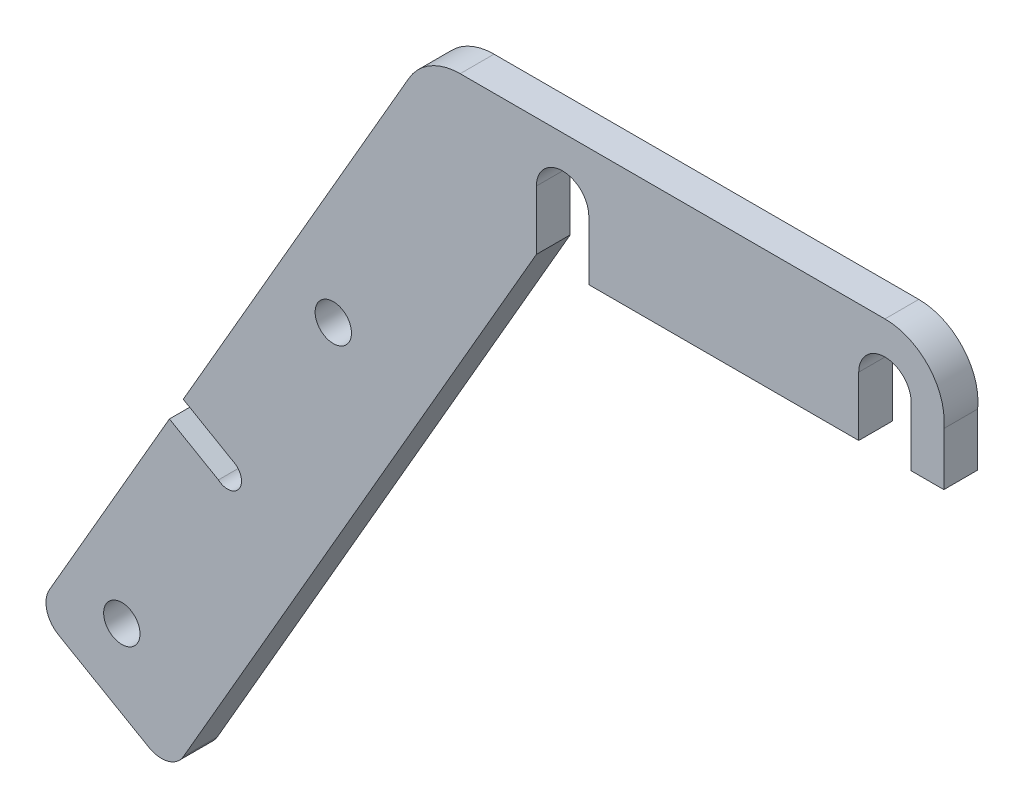
ISO-10303-21;
HEADER;
FILE_DESCRIPTION(('STEP AP214'),'2;1');
FILE_NAME('part.step','',(''),(''),'','','');
FILE_SCHEMA(('AUTOMOTIVE_DESIGN { 1 0 10303 214 1 1 1 1 }'));
ENDSEC;
DATA;
#1=APPLICATION_CONTEXT('core data for automotive mechanical design processes');
#2=APPLICATION_PROTOCOL_DEFINITION('international standard','automotive_design',2000,#1);
#3=PRODUCT_CONTEXT('',#1,'mechanical');
#4=PRODUCT('Part','Part','',(#3));
#5=PRODUCT_RELATED_PRODUCT_CATEGORY('part','',(#4));
#6=PRODUCT_DEFINITION_FORMATION('','',#4);
#7=PRODUCT_DEFINITION_CONTEXT('part definition',#1,'design');
#8=PRODUCT_DEFINITION('design','',#6,#7);
#9=PRODUCT_DEFINITION_SHAPE('','',#8);
#10=(LENGTH_UNIT() NAMED_UNIT(*) SI_UNIT(.MILLI.,.METRE.));
#11=(NAMED_UNIT(*) PLANE_ANGLE_UNIT() SI_UNIT($,.RADIAN.));
#12=(NAMED_UNIT(*) SI_UNIT($,.STERADIAN.) SOLID_ANGLE_UNIT());
#13=UNCERTAINTY_MEASURE_WITH_UNIT(LENGTH_MEASURE(1.E-05),#10,'distance_accuracy_value','');
#14=(GEOMETRIC_REPRESENTATION_CONTEXT(3) GLOBAL_UNCERTAINTY_ASSIGNED_CONTEXT((#13)) GLOBAL_UNIT_ASSIGNED_CONTEXT((#10,
#11,#12)) REPRESENTATION_CONTEXT('',''));
#15=CARTESIAN_POINT('',(0.,0.,0.));
#16=DIRECTION('',(0.,0.,1.));
#17=DIRECTION('',(1.,0.,0.));
#18=AXIS2_PLACEMENT_3D('',#15,#16,#17);
#19=CARTESIAN_POINT('',(0.,0.,4.));
#20=DIRECTION('',(0.,0.,1.));
#21=DIRECTION('',(1.,0.,0.));
#22=AXIS2_PLACEMENT_3D('',#19,#20,#21);
#23=PLANE('',#22);
#24=CARTESIAN_POINT('',(-52.1066641993581,-69.2820323027551,4.));
#25=DIRECTION('',(0.,0.,1.));
#26=DIRECTION('',(1.,0.,0.));
#27=AXIS2_PLACEMENT_3D('',#24,#25,#26);
#28=CIRCLE('',#27,2.15);
#29=CARTESIAN_POINT('',(-49.9566641993581,-69.2820323027551,4.));
#30=VERTEX_POINT('',#29);
#31=EDGE_CURVE('E210',#30,#30,#28,.T.);
#32=ORIENTED_EDGE('',*,*,#31,.F.);
#33=EDGE_LOOP('',(#32));
#34=FACE_BOUND('',#33,.T.);
#35=CARTESIAN_POINT('',(0.,0.,4.));
#36=DIRECTION('',(0.,0.,-1.));
#37=DIRECTION('',(1.,0.,0.));
#38=AXIS2_PLACEMENT_3D('',#35,#36,#37);
#39=CIRCLE('',#38,3.1);
#40=CARTESIAN_POINT('',(-3.1,0.,4.));
#41=VERTEX_POINT('',#40);
#42=CARTESIAN_POINT('',(3.1,0.,4.));
#43=VERTEX_POINT('',#42);
#44=EDGE_CURVE('E247',#41,#43,#39,.T.);
#45=ORIENTED_EDGE('',*,*,#44,.T.);
#46=DIRECTION('',(0.,-1.,0.));
#47=VECTOR('',#46,1.);
#48=CARTESIAN_POINT('',(3.1,0.,4.));
#49=LINE('',#48,#47);
#50=CARTESIAN_POINT('',(3.1,-7.,4.));
#51=VERTEX_POINT('',#50);
#52=EDGE_CURVE('E130',#43,#51,#49,.T.);
#53=ORIENTED_EDGE('',*,*,#52,.T.);
#54=DIRECTION('',(1.,0.,0.));
#55=VECTOR('',#54,1.);
#56=CARTESIAN_POINT('',(3.1,-7.,4.));
#57=LINE('',#56,#55);
#58=CARTESIAN_POINT('',(35.005,-7.,4.));
#59=VERTEX_POINT('',#58);
#60=EDGE_CURVE('E301',#51,#59,#57,.T.);
#61=ORIENTED_EDGE('',*,*,#60,.T.);
#62=DIRECTION('',(0.,1.,0.));
#63=VECTOR('',#62,1.);
#64=CARTESIAN_POINT('',(35.005,-7.,4.));
#65=LINE('',#64,#63);
#66=CARTESIAN_POINT('',(35.005,0.,4.));
#67=VERTEX_POINT('',#66);
#68=EDGE_CURVE('E320',#59,#67,#65,.T.);
#69=ORIENTED_EDGE('',*,*,#68,.T.);
#70=CARTESIAN_POINT('',(38.105,0.,4.));
#71=DIRECTION('',(0.,0.,-1.));
#72=DIRECTION('',(1.,0.,0.));
#73=AXIS2_PLACEMENT_3D('',#70,#71,#72);
#74=CIRCLE('',#73,3.1);
#75=CARTESIAN_POINT('',(41.205,0.,4.));
#76=VERTEX_POINT('',#75);
#77=EDGE_CURVE('E317',#67,#76,#74,.T.);
#78=ORIENTED_EDGE('',*,*,#77,.T.);
#79=DIRECTION('',(0.,-1.,0.));
#80=VECTOR('',#79,1.);
#81=CARTESIAN_POINT('',(41.205,0.,4.));
#82=LINE('',#81,#80);
#83=CARTESIAN_POINT('',(41.205,-7.,4.));
#84=VERTEX_POINT('',#83);
#85=EDGE_CURVE('E319',#76,#84,#82,.T.);
#86=ORIENTED_EDGE('',*,*,#85,.T.);
#87=DIRECTION('',(1.,0.,0.));
#88=VECTOR('',#87,1.);
#89=CARTESIAN_POINT('',(41.205,-7.,4.));
#90=LINE('',#89,#88);
#91=CARTESIAN_POINT('',(45.0649258350727,-7.,4.));
#92=VERTEX_POINT('',#91);
#93=EDGE_CURVE('E322',#84,#92,#90,.T.);
#94=ORIENTED_EDGE('',*,*,#93,.T.);
#95=DIRECTION('',(0.,1.,0.));
#96=VECTOR('',#95,1.);
#97=CARTESIAN_POINT('',(45.0649258350727,-7.,4.));
#98=LINE('',#97,#96);
#99=CARTESIAN_POINT('',(45.0649258350727,-0.747952117643216,4.));
#100=VERTEX_POINT('',#99);
#101=EDGE_CURVE('E328',#92,#100,#98,.T.);
#102=ORIENTED_EDGE('',*,*,#101,.T.);
#103=CARTESIAN_POINT('',(38.105,0.,4.));
#104=DIRECTION('',(0.,0.,1.));
#105=DIRECTION('',(1.,0.,0.));
#106=AXIS2_PLACEMENT_3D('',#103,#104,#105);
#107=CIRCLE('',#106,7.);
#108=CARTESIAN_POINT('',(38.105,7.,4.));
#109=VERTEX_POINT('',#108);
#110=EDGE_CURVE('E330',#100,#109,#107,.T.);
#111=ORIENTED_EDGE('',*,*,#110,.T.);
#112=DIRECTION('',(-1.,0.,0.));
#113=VECTOR('',#112,1.);
#114=CARTESIAN_POINT('',(-12.1066641993582,7.,4.));
#115=LINE('',#114,#113);
#116=CARTESIAN_POINT('',(-12.1066641993582,7.,4.));
#117=VERTEX_POINT('',#116);
#118=EDGE_CURVE('E332',#109,#117,#115,.T.);
#119=ORIENTED_EDGE('',*,*,#118,.T.);
#120=CARTESIAN_POINT('',(-12.1066641993582,0.,4.));
#121=DIRECTION('',(0.,0.,1.));
#122=DIRECTION('',(-1.,0.,0.));
#123=AXIS2_PLACEMENT_3D('',#120,#121,#122);
#124=CIRCLE('',#123,7.);
#125=CARTESIAN_POINT('',(-18.1688420258492,3.5,4.));
#126=VERTEX_POINT('',#125);
#127=EDGE_CURVE('E334',#117,#126,#124,.T.);
#128=ORIENTED_EDGE('',*,*,#127,.T.);
#129=DIRECTION('',(-0.5,-0.866025403784439,0.));
#130=VECTOR('',#129,1.);
#131=CARTESIAN_POINT('',(-18.1688420258492,3.5,4.));
#132=LINE('',#131,#130);
#133=CARTESIAN_POINT('',(-44.8438420258492,-42.7024552918998,4.));
#134=VERTEX_POINT('',#133);
#135=EDGE_CURVE('E336',#126,#134,#132,.T.);
#136=ORIENTED_EDGE('',*,*,#135,.T.);
#137=DIRECTION('',(0.86602540378444,-0.499999999999998,0.));
#138=VECTOR('',#137,1.);
#139=CARTESIAN_POINT('',(-38.7816641993581,-46.2024552918998,4.));
#140=LINE('',#139,#138);
#141=CARTESIAN_POINT('',(-38.7816641993581,-46.2024552918998,4.));
#142=VERTEX_POINT('',#141);
#143=EDGE_CURVE('E338',#134,#142,#140,.T.);
#144=ORIENTED_EDGE('',*,*,#143,.T.);
#145=CARTESIAN_POINT('',(-39.6066641993581,-47.6313972081441,4.));
#146=DIRECTION('',(0.,0.,-1.));
#147=DIRECTION('',(1.,0.,0.));
#148=AXIS2_PLACEMENT_3D('',#145,#146,#147);
#149=CIRCLE('',#148,1.65000000000001);
#150=CARTESIAN_POINT('',(-40.6904271192415,-48.8755667840002,4.));
#151=VERTEX_POINT('',#150);
#152=EDGE_CURVE('E340',#142,#151,#149,.T.);
#153=ORIENTED_EDGE('',*,*,#152,.T.);
#154=DIRECTION('',(-0.866025403784439,0.5,0.));
#155=VECTOR('',#154,1.);
#156=CARTESIAN_POINT('',(-40.6904271192415,-48.8755667840002,4.));
#157=LINE('',#156,#155);
#158=CARTESIAN_POINT('',(-46.4785239854736,-45.5338075001855,4.));
#159=VERTEX_POINT('',#158);
#160=EDGE_CURVE('E342',#151,#159,#157,.T.);
#161=ORIENTED_EDGE('',*,*,#160,.T.);
#162=DIRECTION('',(-0.5,-0.866025403784439,0.));
#163=VECTOR('',#162,1.);
#164=CARTESIAN_POINT('',(-46.4785239854736,-45.5338075001855,4.));
#165=LINE('',#164,#163);
#166=CARTESIAN_POINT('',(-60.6688420258492,-70.1121593216773,4.));
#167=VERTEX_POINT('',#166);
#168=EDGE_CURVE('E344',#159,#167,#165,.T.);
#169=ORIENTED_EDGE('',*,*,#168,.T.);
#170=CARTESIAN_POINT('',(-58.0707658144959,-71.6121593216773,4.));
#171=DIRECTION('',(0.,0.,1.));
#172=DIRECTION('',(-1.,0.,0.));
#173=AXIS2_PLACEMENT_3D('',#170,#171,#172);
#174=CIRCLE('',#173,3.00000000000001);
#175=CARTESIAN_POINT('',(-59.5707658144959,-74.2102355330306,4.));
#176=VERTEX_POINT('',#175);
#177=EDGE_CURVE('E346',#167,#176,#174,.T.);
#178=ORIENTED_EDGE('',*,*,#177,.T.);
#179=DIRECTION('',(0.86602540378444,-0.499999999999997,0.));
#180=VECTOR('',#179,1.);
#181=CARTESIAN_POINT('',(-59.5707658144959,-74.2102355330306,4.));
#182=LINE('',#181,#180);
#183=CARTESIAN_POINT('',(-48.9186533479473,-80.3602355330306,4.));
#184=VERTEX_POINT('',#183);
#185=EDGE_CURVE('E188',#176,#184,#182,.T.);
#186=ORIENTED_EDGE('',*,*,#185,.T.);
#187=CARTESIAN_POINT('',(-47.4186533479473,-77.7621593216773,4.));
#188=DIRECTION('',(0.,0.,1.));
#189=DIRECTION('',(1.,0.,0.));
#190=AXIS2_PLACEMENT_3D('',#187,#188,#189);
#191=CIRCLE('',#190,2.99999999999999);
#192=CARTESIAN_POINT('',(-44.820577136594,-79.2621593216773,4.));
#193=VERTEX_POINT('',#192);
#194=EDGE_CURVE('E182',#184,#193,#191,.T.);
#195=ORIENTED_EDGE('',*,*,#194,.T.);
#196=DIRECTION('',(0.5,0.866025403784439,0.));
#197=VECTOR('',#196,1.);
#198=CARTESIAN_POINT('',(-3.1,-7.,4.));
#199=LINE('',#198,#197);
#200=CARTESIAN_POINT('',(-3.1,-7.,4.));
#201=VERTEX_POINT('',#200);
#202=EDGE_CURVE('E186',#193,#201,#199,.T.);
#203=ORIENTED_EDGE('',*,*,#202,.T.);
#204=DIRECTION('',(0.,1.,0.));
#205=VECTOR('',#204,1.);
#206=CARTESIAN_POINT('',(-3.1,-7.,4.));
#207=LINE('',#206,#205);
#208=EDGE_CURVE('E48',#201,#41,#207,.T.);
#209=ORIENTED_EDGE('',*,*,#208,.T.);
#210=EDGE_LOOP('',(#45,#53,#61,#69,#78,#86,#94,#102,#111,#119,#128,#136,#144,#153,#161,#169,
#178,#186,#195,#203,#209));
#211=FACE_BOUND('',#210,.T.);
#212=CARTESIAN_POINT('',(-27.1066641993581,-25.9807621135332,4.));
#213=DIRECTION('',(0.,0.,1.));
#214=DIRECTION('',(1.,0.,0.));
#215=AXIS2_PLACEMENT_3D('',#212,#213,#214);
#216=CIRCLE('',#215,2.15);
#217=CARTESIAN_POINT('',(-24.9566641993581,-25.9807621135332,4.));
#218=VERTEX_POINT('',#217);
#219=EDGE_CURVE('E389',#218,#218,#216,.T.);
#220=ORIENTED_EDGE('',*,*,#219,.F.);
#221=EDGE_LOOP('',(#220));
#222=FACE_BOUND('',#221,.T.);
#223=ADVANCED_FACE('F31',(#34,#211,#222),#23,.T.);
#224=CARTESIAN_POINT('',(0.,0.,0.));
#225=DIRECTION('',(0.,0.,1.));
#226=DIRECTION('',(1.,0.,0.));
#227=AXIS2_PLACEMENT_3D('',#224,#225,#226);
#228=PLANE('',#227);
#229=CARTESIAN_POINT('',(-52.1066641993581,-69.2820323027551,0.));
#230=DIRECTION('',(0.,0.,1.));
#231=DIRECTION('',(1.,0.,0.));
#232=AXIS2_PLACEMENT_3D('',#229,#230,#231);
#233=CIRCLE('',#232,2.15);
#234=CARTESIAN_POINT('',(-49.9566641993581,-69.2820323027551,0.));
#235=VERTEX_POINT('',#234);
#236=EDGE_CURVE('E394',#235,#235,#233,.T.);
#237=ORIENTED_EDGE('',*,*,#236,.T.);
#238=EDGE_LOOP('',(#237));
#239=FACE_BOUND('',#238,.T.);
#240=CARTESIAN_POINT('',(0.,0.,0.));
#241=DIRECTION('',(0.,0.,-1.));
#242=DIRECTION('',(1.,0.,0.));
#243=AXIS2_PLACEMENT_3D('',#240,#241,#242);
#244=CIRCLE('',#243,3.1);
#245=CARTESIAN_POINT('',(-3.1,0.,0.));
#246=VERTEX_POINT('',#245);
#247=CARTESIAN_POINT('',(3.1,0.,0.));
#248=VERTEX_POINT('',#247);
#249=EDGE_CURVE('E206',#246,#248,#244,.T.);
#250=ORIENTED_EDGE('',*,*,#249,.F.);
#251=DIRECTION('',(0.,1.,0.));
#252=VECTOR('',#251,1.);
#253=CARTESIAN_POINT('',(-3.1,-7.,0.));
#254=LINE('',#253,#252);
#255=CARTESIAN_POINT('',(-3.1,-7.,0.));
#256=VERTEX_POINT('',#255);
#257=EDGE_CURVE('E122',#256,#246,#254,.T.);
#258=ORIENTED_EDGE('',*,*,#257,.F.);
#259=DIRECTION('',(0.5,0.866025403784439,0.));
#260=VECTOR('',#259,1.);
#261=CARTESIAN_POINT('',(-3.1,-7.,0.));
#262=LINE('',#261,#260);
#263=CARTESIAN_POINT('',(-44.820577136594,-79.2621593216773,0.));
#264=VERTEX_POINT('',#263);
#265=EDGE_CURVE('E116',#264,#256,#262,.T.);
#266=ORIENTED_EDGE('',*,*,#265,.F.);
#267=CARTESIAN_POINT('',(-47.4186533479473,-77.7621593216773,0.));
#268=DIRECTION('',(0.,0.,1.));
#269=DIRECTION('',(1.,0.,0.));
#270=AXIS2_PLACEMENT_3D('',#267,#268,#269);
#271=CIRCLE('',#270,2.99999999999999);
#272=CARTESIAN_POINT('',(-48.9186533479473,-80.3602355330306,0.));
#273=VERTEX_POINT('',#272);
#274=EDGE_CURVE('E196',#273,#264,#271,.T.);
#275=ORIENTED_EDGE('',*,*,#274,.F.);
#276=DIRECTION('',(0.86602540378444,-0.499999999999997,0.));
#277=VECTOR('',#276,1.);
#278=CARTESIAN_POINT('',(-59.5707658144959,-74.2102355330306,0.));
#279=LINE('',#278,#277);
#280=CARTESIAN_POINT('',(-59.5707658144959,-74.2102355330306,0.));
#281=VERTEX_POINT('',#280);
#282=EDGE_CURVE('E242',#281,#273,#279,.T.);
#283=ORIENTED_EDGE('',*,*,#282,.F.);
#284=CARTESIAN_POINT('',(-58.0707658144959,-71.6121593216773,0.));
#285=DIRECTION('',(0.,0.,1.));
#286=DIRECTION('',(-1.,0.,0.));
#287=AXIS2_PLACEMENT_3D('',#284,#285,#286);
#288=CIRCLE('',#287,3.00000000000001);
#289=CARTESIAN_POINT('',(-60.6688420258492,-70.1121593216773,0.));
#290=VERTEX_POINT('',#289);
#291=EDGE_CURVE('E240',#290,#281,#288,.T.);
#292=ORIENTED_EDGE('',*,*,#291,.F.);
#293=DIRECTION('',(-0.5,-0.866025403784439,0.));
#294=VECTOR('',#293,1.);
#295=CARTESIAN_POINT('',(-46.4785239854736,-45.5338075001855,0.));
#296=LINE('',#295,#294);
#297=CARTESIAN_POINT('',(-46.4785239854736,-45.5338075001855,0.));
#298=VERTEX_POINT('',#297);
#299=EDGE_CURVE('E238',#298,#290,#296,.T.);
#300=ORIENTED_EDGE('',*,*,#299,.F.);
#301=DIRECTION('',(-0.866025403784439,0.5,0.));
#302=VECTOR('',#301,1.);
#303=CARTESIAN_POINT('',(-40.6904271192415,-48.8755667840002,0.));
#304=LINE('',#303,#302);
#305=CARTESIAN_POINT('',(-40.6904271192415,-48.8755667840002,0.));
#306=VERTEX_POINT('',#305);
#307=EDGE_CURVE('E236',#306,#298,#304,.T.);
#308=ORIENTED_EDGE('',*,*,#307,.F.);
#309=CARTESIAN_POINT('',(-39.6066641993581,-47.6313972081441,0.));
#310=DIRECTION('',(0.,0.,-1.));
#311=DIRECTION('',(1.,0.,0.));
#312=AXIS2_PLACEMENT_3D('',#309,#310,#311);
#313=CIRCLE('',#312,1.65000000000001);
#314=CARTESIAN_POINT('',(-38.7816641993581,-46.2024552918998,0.));
#315=VERTEX_POINT('',#314);
#316=EDGE_CURVE('E234',#315,#306,#313,.T.);
#317=ORIENTED_EDGE('',*,*,#316,.F.);
#318=DIRECTION('',(0.86602540378444,-0.499999999999998,0.));
#319=VECTOR('',#318,1.);
#320=CARTESIAN_POINT('',(-38.7816641993581,-46.2024552918998,0.));
#321=LINE('',#320,#319);
#322=CARTESIAN_POINT('',(-44.8438420258492,-42.7024552918998,0.));
#323=VERTEX_POINT('',#322);
#324=EDGE_CURVE('E232',#323,#315,#321,.T.);
#325=ORIENTED_EDGE('',*,*,#324,.F.);
#326=DIRECTION('',(-0.5,-0.866025403784439,0.));
#327=VECTOR('',#326,1.);
#328=CARTESIAN_POINT('',(-18.1688420258492,3.5,0.));
#329=LINE('',#328,#327);
#330=CARTESIAN_POINT('',(-18.1688420258492,3.5,0.));
#331=VERTEX_POINT('',#330);
#332=EDGE_CURVE('E230',#331,#323,#329,.T.);
#333=ORIENTED_EDGE('',*,*,#332,.F.);
#334=CARTESIAN_POINT('',(-12.1066641993582,0.,0.));
#335=DIRECTION('',(0.,0.,1.));
#336=DIRECTION('',(-1.,0.,0.));
#337=AXIS2_PLACEMENT_3D('',#334,#335,#336);
#338=CIRCLE('',#337,7.);
#339=CARTESIAN_POINT('',(-12.1066641993582,7.,0.));
#340=VERTEX_POINT('',#339);
#341=EDGE_CURVE('E228',#340,#331,#338,.T.);
#342=ORIENTED_EDGE('',*,*,#341,.F.);
#343=DIRECTION('',(-1.,0.,0.));
#344=VECTOR('',#343,1.);
#345=CARTESIAN_POINT('',(-12.1066641993582,7.,0.));
#346=LINE('',#345,#344);
#347=CARTESIAN_POINT('',(38.105,7.,0.));
#348=VERTEX_POINT('',#347);
#349=EDGE_CURVE('E226',#348,#340,#346,.T.);
#350=ORIENTED_EDGE('',*,*,#349,.F.);
#351=CARTESIAN_POINT('',(38.105,0.,0.));
#352=DIRECTION('',(0.,0.,1.));
#353=DIRECTION('',(1.,0.,0.));
#354=AXIS2_PLACEMENT_3D('',#351,#352,#353);
#355=CIRCLE('',#354,7.);
#356=CARTESIAN_POINT('',(45.0649258350727,-0.747952117643216,0.));
#357=VERTEX_POINT('',#356);
#358=EDGE_CURVE('E224',#357,#348,#355,.T.);
#359=ORIENTED_EDGE('',*,*,#358,.F.);
#360=DIRECTION('',(0.,1.,0.));
#361=VECTOR('',#360,1.);
#362=CARTESIAN_POINT('',(45.0649258350727,-7.,0.));
#363=LINE('',#362,#361);
#364=CARTESIAN_POINT('',(45.0649258350727,-7.,0.));
#365=VERTEX_POINT('',#364);
#366=EDGE_CURVE('E222',#365,#357,#363,.T.);
#367=ORIENTED_EDGE('',*,*,#366,.F.);
#368=DIRECTION('',(1.,0.,0.));
#369=VECTOR('',#368,1.);
#370=CARTESIAN_POINT('',(41.205,-7.,0.));
#371=LINE('',#370,#369);
#372=CARTESIAN_POINT('',(41.205,-7.,0.));
#373=VERTEX_POINT('',#372);
#374=EDGE_CURVE('E220',#373,#365,#371,.T.);
#375=ORIENTED_EDGE('',*,*,#374,.F.);
#376=DIRECTION('',(0.,-1.,0.));
#377=VECTOR('',#376,1.);
#378=CARTESIAN_POINT('',(41.205,0.,0.));
#379=LINE('',#378,#377);
#380=CARTESIAN_POINT('',(41.205,0.,0.));
#381=VERTEX_POINT('',#380);
#382=EDGE_CURVE('E218',#381,#373,#379,.T.);
#383=ORIENTED_EDGE('',*,*,#382,.F.);
#384=CARTESIAN_POINT('',(38.105,0.,0.));
#385=DIRECTION('',(0.,0.,-1.));
#386=DIRECTION('',(1.,0.,0.));
#387=AXIS2_PLACEMENT_3D('',#384,#385,#386);
#388=CIRCLE('',#387,3.1);
#389=CARTESIAN_POINT('',(35.005,0.,0.));
#390=VERTEX_POINT('',#389);
#391=EDGE_CURVE('E216',#390,#381,#388,.T.);
#392=ORIENTED_EDGE('',*,*,#391,.F.);
#393=DIRECTION('',(0.,1.,0.));
#394=VECTOR('',#393,1.);
#395=CARTESIAN_POINT('',(35.005,-7.,0.));
#396=LINE('',#395,#394);
#397=CARTESIAN_POINT('',(35.005,-7.,0.));
#398=VERTEX_POINT('',#397);
#399=EDGE_CURVE('E214',#398,#390,#396,.T.);
#400=ORIENTED_EDGE('',*,*,#399,.F.);
#401=DIRECTION('',(1.,0.,0.));
#402=VECTOR('',#401,1.);
#403=CARTESIAN_POINT('',(3.1,-7.,0.));
#404=LINE('',#403,#402);
#405=CARTESIAN_POINT('',(3.1,-7.,0.));
#406=VERTEX_POINT('',#405);
#407=EDGE_CURVE('E212',#406,#398,#404,.T.);
#408=ORIENTED_EDGE('',*,*,#407,.F.);
#409=DIRECTION('',(0.,-1.,0.));
#410=VECTOR('',#409,1.);
#411=CARTESIAN_POINT('',(3.1,0.,0.));
#412=LINE('',#411,#410);
#413=EDGE_CURVE('E209',#248,#406,#412,.T.);
#414=ORIENTED_EDGE('',*,*,#413,.F.);
#415=EDGE_LOOP('',(#250,#258,#266,#275,#283,#292,#300,#308,#317,#325,#333,#342,#350,#359,#367,
#375,#383,#392,#400,#408,#414));
#416=FACE_BOUND('',#415,.T.);
#417=CARTESIAN_POINT('',(-27.1066641993581,-25.9807621135332,0.));
#418=DIRECTION('',(0.,0.,1.));
#419=DIRECTION('',(1.,0.,0.));
#420=AXIS2_PLACEMENT_3D('',#417,#418,#419);
#421=CIRCLE('',#420,2.15);
#422=CARTESIAN_POINT('',(-24.9566641993581,-25.9807621135332,0.));
#423=VERTEX_POINT('',#422);
#424=EDGE_CURVE('E392',#423,#423,#421,.T.);
#425=ORIENTED_EDGE('',*,*,#424,.T.);
#426=EDGE_LOOP('',(#425));
#427=FACE_BOUND('',#426,.T.);
#428=ADVANCED_FACE('F305',(#239,#416,#427),#228,.F.);
#429=CARTESIAN_POINT('',(0.,0.,4.));
#430=DIRECTION('',(0.,0.,-1.));
#431=DIRECTION('',(-1.,0.,0.));
#432=AXIS2_PLACEMENT_3D('',#429,#430,#431);
#433=CYLINDRICAL_SURFACE('',#432,3.1);
#434=ORIENTED_EDGE('',*,*,#249,.T.);
#435=DIRECTION('',(0.,0.,-1.));
#436=VECTOR('',#435,1.);
#437=CARTESIAN_POINT('',(3.1,0.,4.));
#438=LINE('',#437,#436);
#439=EDGE_CURVE('E11',#43,#248,#438,.T.);
#440=ORIENTED_EDGE('',*,*,#439,.F.);
#441=ORIENTED_EDGE('',*,*,#44,.F.);
#442=DIRECTION('',(0.,0.,-1.));
#443=VECTOR('',#442,1.);
#444=CARTESIAN_POINT('',(-3.1,0.,4.));
#445=LINE('',#444,#443);
#446=EDGE_CURVE('E202',#41,#246,#445,.T.);
#447=ORIENTED_EDGE('',*,*,#446,.T.);
#448=EDGE_LOOP('',(#434,#440,#441,#447));
#449=FACE_BOUND('',#448,.T.);
#450=ADVANCED_FACE('F33',(#449),#433,.F.);
#451=CARTESIAN_POINT('',(3.1,0.,4.));
#452=DIRECTION('',(1.,0.,0.));
#453=DIRECTION('',(0.,1.,0.));
#454=AXIS2_PLACEMENT_3D('',#451,#452,#453);
#455=PLANE('',#454);
#456=ORIENTED_EDGE('',*,*,#413,.T.);
#457=DIRECTION('',(0.,0.,-1.));
#458=VECTOR('',#457,1.);
#459=CARTESIAN_POINT('',(3.1,-7.,4.));
#460=LINE('',#459,#458);
#461=EDGE_CURVE('E40',#51,#406,#460,.T.);
#462=ORIENTED_EDGE('',*,*,#461,.F.);
#463=ORIENTED_EDGE('',*,*,#52,.F.);
#464=ORIENTED_EDGE('',*,*,#439,.T.);
#465=EDGE_LOOP('',(#456,#462,#463,#464));
#466=FACE_BOUND('',#465,.T.);
#467=ADVANCED_FACE('F577',(#466),#455,.F.);
#468=CARTESIAN_POINT('',(3.1,-7.,4.));
#469=DIRECTION('',(0.,1.,0.));
#470=DIRECTION('',(-1.,0.,0.));
#471=AXIS2_PLACEMENT_3D('',#468,#469,#470);
#472=PLANE('',#471);
#473=ORIENTED_EDGE('',*,*,#407,.T.);
#474=DIRECTION('',(0.,0.,-1.));
#475=VECTOR('',#474,1.);
#476=CARTESIAN_POINT('',(35.005,-7.,4.));
#477=LINE('',#476,#475);
#478=EDGE_CURVE('E293',#59,#398,#477,.T.);
#479=ORIENTED_EDGE('',*,*,#478,.F.);
#480=ORIENTED_EDGE('',*,*,#60,.F.);
#481=ORIENTED_EDGE('',*,*,#461,.T.);
#482=EDGE_LOOP('',(#473,#479,#480,#481));
#483=FACE_BOUND('',#482,.T.);
#484=ADVANCED_FACE('F299',(#483),#472,.F.);
#485=CARTESIAN_POINT('',(35.005,-7.,4.));
#486=DIRECTION('',(-1.,0.,0.));
#487=DIRECTION('',(0.,0.,1.));
#488=AXIS2_PLACEMENT_3D('',#485,#486,#487);
#489=PLANE('',#488);
#490=ORIENTED_EDGE('',*,*,#399,.T.);
#491=DIRECTION('',(0.,0.,-1.));
#492=VECTOR('',#491,1.);
#493=CARTESIAN_POINT('',(35.005,0.,4.));
#494=LINE('',#493,#492);
#495=EDGE_CURVE('E290',#67,#390,#494,.T.);
#496=ORIENTED_EDGE('',*,*,#495,.F.);
#497=ORIENTED_EDGE('',*,*,#68,.F.);
#498=ORIENTED_EDGE('',*,*,#478,.T.);
#499=EDGE_LOOP('',(#490,#496,#497,#498));
#500=FACE_BOUND('',#499,.T.);
#501=ADVANCED_FACE('F311',(#500),#489,.F.);
#502=CARTESIAN_POINT('',(38.105,0.,4.));
#503=DIRECTION('',(0.,0.,-1.));
#504=DIRECTION('',(-1.,0.,0.));
#505=AXIS2_PLACEMENT_3D('',#502,#503,#504);
#506=CYLINDRICAL_SURFACE('',#505,3.1);
#507=ORIENTED_EDGE('',*,*,#391,.T.);
#508=DIRECTION('',(0.,0.,-1.));
#509=VECTOR('',#508,1.);
#510=CARTESIAN_POINT('',(41.205,0.,4.));
#511=LINE('',#510,#509);
#512=EDGE_CURVE('E287',#76,#381,#511,.T.);
#513=ORIENTED_EDGE('',*,*,#512,.F.);
#514=ORIENTED_EDGE('',*,*,#77,.F.);
#515=ORIENTED_EDGE('',*,*,#495,.T.);
#516=EDGE_LOOP('',(#507,#513,#514,#515));
#517=FACE_BOUND('',#516,.T.);
#518=ADVANCED_FACE('F315',(#517),#506,.F.);
#519=CARTESIAN_POINT('',(41.205,0.,4.));
#520=DIRECTION('',(1.,0.,0.));
#521=DIRECTION('',(0.,0.,-1.));
#522=AXIS2_PLACEMENT_3D('',#519,#520,#521);
#523=PLANE('',#522);
#524=ORIENTED_EDGE('',*,*,#382,.T.);
#525=DIRECTION('',(0.,0.,-1.));
#526=VECTOR('',#525,1.);
#527=CARTESIAN_POINT('',(41.205,-7.,4.));
#528=LINE('',#527,#526);
#529=EDGE_CURVE('E284',#84,#373,#528,.T.);
#530=ORIENTED_EDGE('',*,*,#529,.F.);
#531=ORIENTED_EDGE('',*,*,#85,.F.);
#532=ORIENTED_EDGE('',*,*,#512,.T.);
#533=EDGE_LOOP('',(#524,#530,#531,#532));
#534=FACE_BOUND('',#533,.T.);
#535=ADVANCED_FACE('F542',(#534),#523,.F.);
#536=CARTESIAN_POINT('',(41.205,-7.,4.));
#537=DIRECTION('',(0.,1.,0.));
#538=DIRECTION('',(0.,0.,1.));
#539=AXIS2_PLACEMENT_3D('',#536,#537,#538);
#540=PLANE('',#539);
#541=ORIENTED_EDGE('',*,*,#374,.T.);
#542=DIRECTION('',(0.,0.,-1.));
#543=VECTOR('',#542,1.);
#544=CARTESIAN_POINT('',(45.0649258350727,-7.,4.));
#545=LINE('',#544,#543);
#546=EDGE_CURVE('E281',#92,#365,#545,.T.);
#547=ORIENTED_EDGE('',*,*,#546,.F.);
#548=ORIENTED_EDGE('',*,*,#93,.F.);
#549=ORIENTED_EDGE('',*,*,#529,.T.);
#550=EDGE_LOOP('',(#541,#547,#548,#549));
#551=FACE_BOUND('',#550,.T.);
#552=ADVANCED_FACE('F532',(#551),#540,.F.);
#553=CARTESIAN_POINT('',(45.0649258350727,-7.,4.));
#554=DIRECTION('',(-1.,0.,0.));
#555=DIRECTION('',(0.,0.,1.));
#556=AXIS2_PLACEMENT_3D('',#553,#554,#555);
#557=PLANE('',#556);
#558=ORIENTED_EDGE('',*,*,#366,.T.);
#559=DIRECTION('',(0.,0.,-1.));
#560=VECTOR('',#559,1.);
#561=CARTESIAN_POINT('',(45.0649258350727,-0.747952117643216,4.));
#562=LINE('',#561,#560);
#563=EDGE_CURVE('E278',#100,#357,#562,.T.);
#564=ORIENTED_EDGE('',*,*,#563,.F.);
#565=ORIENTED_EDGE('',*,*,#101,.F.);
#566=ORIENTED_EDGE('',*,*,#546,.T.);
#567=EDGE_LOOP('',(#558,#564,#565,#566));
#568=FACE_BOUND('',#567,.T.);
#569=ADVANCED_FACE('F522',(#568),#557,.F.);
#570=CARTESIAN_POINT('',(38.105,0.,4.));
#571=DIRECTION('',(0.,0.,-1.));
#572=DIRECTION('',(-1.,0.,0.));
#573=AXIS2_PLACEMENT_3D('',#570,#571,#572);
#574=CYLINDRICAL_SURFACE('',#573,7.);
#575=ORIENTED_EDGE('',*,*,#358,.T.);
#576=DIRECTION('',(0.,0.,-1.));
#577=VECTOR('',#576,1.);
#578=CARTESIAN_POINT('',(38.105,7.,4.));
#579=LINE('',#578,#577);
#580=EDGE_CURVE('E275',#109,#348,#579,.T.);
#581=ORIENTED_EDGE('',*,*,#580,.F.);
#582=ORIENTED_EDGE('',*,*,#110,.F.);
#583=ORIENTED_EDGE('',*,*,#563,.T.);
#584=EDGE_LOOP('',(#575,#581,#582,#583));
#585=FACE_BOUND('',#584,.T.);
#586=ADVANCED_FACE('F512',(#585),#574,.T.);
#587=CARTESIAN_POINT('',(-12.1066641993582,7.,4.));
#588=DIRECTION('',(0.,-1.,0.));
#589=DIRECTION('',(0.,0.,-1.));
#590=AXIS2_PLACEMENT_3D('',#587,#588,#589);
#591=PLANE('',#590);
#592=ORIENTED_EDGE('',*,*,#349,.T.);
#593=DIRECTION('',(0.,0.,-1.));
#594=VECTOR('',#593,1.);
#595=CARTESIAN_POINT('',(-12.1066641993582,7.,4.));
#596=LINE('',#595,#594);
#597=EDGE_CURVE('E272',#117,#340,#596,.T.);
#598=ORIENTED_EDGE('',*,*,#597,.F.);
#599=ORIENTED_EDGE('',*,*,#118,.F.);
#600=ORIENTED_EDGE('',*,*,#580,.T.);
#601=EDGE_LOOP('',(#592,#598,#599,#600));
#602=FACE_BOUND('',#601,.T.);
#603=ADVANCED_FACE('F502',(#602),#591,.F.);
#604=CARTESIAN_POINT('',(-12.1066641993582,0.,4.));
#605=DIRECTION('',(0.,0.,-1.));
#606=DIRECTION('',(-1.,0.,0.));
#607=AXIS2_PLACEMENT_3D('',#604,#605,#606);
#608=CYLINDRICAL_SURFACE('',#607,7.);
#609=ORIENTED_EDGE('',*,*,#341,.T.);
#610=DIRECTION('',(0.,0.,-1.));
#611=VECTOR('',#610,1.);
#612=CARTESIAN_POINT('',(-18.1688420258492,3.5,4.));
#613=LINE('',#612,#611);
#614=EDGE_CURVE('E269',#126,#331,#613,.T.);
#615=ORIENTED_EDGE('',*,*,#614,.F.);
#616=ORIENTED_EDGE('',*,*,#127,.F.);
#617=ORIENTED_EDGE('',*,*,#597,.T.);
#618=EDGE_LOOP('',(#609,#615,#616,#617));
#619=FACE_BOUND('',#618,.T.);
#620=ADVANCED_FACE('F492',(#619),#608,.T.);
#621=CARTESIAN_POINT('',(-18.1688420258492,3.5,4.));
#622=DIRECTION('',(0.866025403784439,-0.5,0.));
#623=DIRECTION('',(0.5,0.866025403784439,0.));
#624=AXIS2_PLACEMENT_3D('',#621,#622,#623);
#625=PLANE('',#624);
#626=ORIENTED_EDGE('',*,*,#332,.T.);
#627=DIRECTION('',(0.,0.,-1.));
#628=VECTOR('',#627,1.);
#629=CARTESIAN_POINT('',(-44.8438420258492,-42.7024552918998,4.));
#630=LINE('',#629,#628);
#631=EDGE_CURVE('E266',#134,#323,#630,.T.);
#632=ORIENTED_EDGE('',*,*,#631,.F.);
#633=ORIENTED_EDGE('',*,*,#135,.F.);
#634=ORIENTED_EDGE('',*,*,#614,.T.);
#635=EDGE_LOOP('',(#626,#632,#633,#634));
#636=FACE_BOUND('',#635,.T.);
#637=ADVANCED_FACE('F482',(#636),#625,.F.);
#638=CARTESIAN_POINT('',(-38.7816641993581,-46.2024552918998,4.));
#639=DIRECTION('',(0.499999999999998,0.86602540378444,0.));
#640=DIRECTION('',(-0.86602540378444,0.499999999999998,0.));
#641=AXIS2_PLACEMENT_3D('',#638,#639,#640);
#642=PLANE('',#641);
#643=ORIENTED_EDGE('',*,*,#324,.T.);
#644=DIRECTION('',(0.,0.,-1.));
#645=VECTOR('',#644,1.);
#646=CARTESIAN_POINT('',(-38.7816641993581,-46.2024552918998,4.));
#647=LINE('',#646,#645);
#648=EDGE_CURVE('E263',#142,#315,#647,.T.);
#649=ORIENTED_EDGE('',*,*,#648,.F.);
#650=ORIENTED_EDGE('',*,*,#143,.F.);
#651=ORIENTED_EDGE('',*,*,#631,.T.);
#652=EDGE_LOOP('',(#643,#649,#650,#651));
#653=FACE_BOUND('',#652,.T.);
#654=ADVANCED_FACE('F472',(#653),#642,.F.);
#655=CARTESIAN_POINT('',(-39.6066641993581,-47.6313972081441,4.));
#656=DIRECTION('',(0.,0.,-1.));
#657=DIRECTION('',(-1.,0.,0.));
#658=AXIS2_PLACEMENT_3D('',#655,#656,#657);
#659=CYLINDRICAL_SURFACE('',#658,1.65000000000001);
#660=ORIENTED_EDGE('',*,*,#316,.T.);
#661=DIRECTION('',(0.,0.,-1.));
#662=VECTOR('',#661,1.);
#663=CARTESIAN_POINT('',(-40.6904271192415,-48.8755667840002,4.));
#664=LINE('',#663,#662);
#665=EDGE_CURVE('E260',#151,#306,#664,.T.);
#666=ORIENTED_EDGE('',*,*,#665,.F.);
#667=ORIENTED_EDGE('',*,*,#152,.F.);
#668=ORIENTED_EDGE('',*,*,#648,.T.);
#669=EDGE_LOOP('',(#660,#666,#667,#668));
#670=FACE_BOUND('',#669,.T.);
#671=ADVANCED_FACE('F462',(#670),#659,.F.);
#672=CARTESIAN_POINT('',(-40.6904271192415,-48.8755667840002,4.));
#673=DIRECTION('',(-0.5,-0.866025403784439,0.));
#674=DIRECTION('',(0.866025403784439,-0.5,0.));
#675=AXIS2_PLACEMENT_3D('',#672,#673,#674);
#676=PLANE('',#675);
#677=ORIENTED_EDGE('',*,*,#307,.T.);
#678=DIRECTION('',(0.,0.,-1.));
#679=VECTOR('',#678,1.);
#680=CARTESIAN_POINT('',(-46.4785239854736,-45.5338075001855,4.));
#681=LINE('',#680,#679);
#682=EDGE_CURVE('E257',#159,#298,#681,.T.);
#683=ORIENTED_EDGE('',*,*,#682,.F.);
#684=ORIENTED_EDGE('',*,*,#160,.F.);
#685=ORIENTED_EDGE('',*,*,#665,.T.);
#686=EDGE_LOOP('',(#677,#683,#684,#685));
#687=FACE_BOUND('',#686,.T.);
#688=ADVANCED_FACE('F452',(#687),#676,.F.);
#689=CARTESIAN_POINT('',(-46.4785239854736,-45.5338075001855,4.));
#690=DIRECTION('',(0.866025403784439,-0.5,0.));
#691=DIRECTION('',(0.5,0.866025403784439,0.));
#692=AXIS2_PLACEMENT_3D('',#689,#690,#691);
#693=PLANE('',#692);
#694=ORIENTED_EDGE('',*,*,#299,.T.);
#695=DIRECTION('',(0.,0.,-1.));
#696=VECTOR('',#695,1.);
#697=CARTESIAN_POINT('',(-60.6688420258492,-70.1121593216773,4.));
#698=LINE('',#697,#696);
#699=EDGE_CURVE('E254',#167,#290,#698,.T.);
#700=ORIENTED_EDGE('',*,*,#699,.F.);
#701=ORIENTED_EDGE('',*,*,#168,.F.);
#702=ORIENTED_EDGE('',*,*,#682,.T.);
#703=EDGE_LOOP('',(#694,#700,#701,#702));
#704=FACE_BOUND('',#703,.T.);
#705=ADVANCED_FACE('F443',(#704),#693,.F.);
#706=CARTESIAN_POINT('',(-58.0707658144959,-71.6121593216773,4.));
#707=DIRECTION('',(0.,0.,-1.));
#708=DIRECTION('',(-1.,0.,0.));
#709=AXIS2_PLACEMENT_3D('',#706,#707,#708);
#710=CYLINDRICAL_SURFACE('',#709,3.00000000000001);
#711=ORIENTED_EDGE('',*,*,#291,.T.);
#712=DIRECTION('',(0.,0.,-1.));
#713=VECTOR('',#712,1.);
#714=CARTESIAN_POINT('',(-59.5707658144959,-74.2102355330306,4.));
#715=LINE('',#714,#713);
#716=EDGE_CURVE('E251',#176,#281,#715,.T.);
#717=ORIENTED_EDGE('',*,*,#716,.F.);
#718=ORIENTED_EDGE('',*,*,#177,.F.);
#719=ORIENTED_EDGE('',*,*,#699,.T.);
#720=EDGE_LOOP('',(#711,#717,#718,#719));
#721=FACE_BOUND('',#720,.T.);
#722=ADVANCED_FACE('F352',(#721),#710,.T.);
#723=CARTESIAN_POINT('',(-59.5707658144959,-74.2102355330306,4.));
#724=DIRECTION('',(0.499999999999997,0.86602540378444,0.));
#725=DIRECTION('',(-0.86602540378444,0.499999999999997,0.));
#726=AXIS2_PLACEMENT_3D('',#723,#724,#725);
#727=PLANE('',#726);
#728=ORIENTED_EDGE('',*,*,#282,.T.);
#729=DIRECTION('',(0.,0.,-1.));
#730=VECTOR('',#729,1.);
#731=CARTESIAN_POINT('',(-48.9186533479473,-80.3602355330306,4.));
#732=LINE('',#731,#730);
#733=EDGE_CURVE('E197',#184,#273,#732,.T.);
#734=ORIENTED_EDGE('',*,*,#733,.F.);
#735=ORIENTED_EDGE('',*,*,#185,.F.);
#736=ORIENTED_EDGE('',*,*,#716,.T.);
#737=EDGE_LOOP('',(#728,#734,#735,#736));
#738=FACE_BOUND('',#737,.T.);
#739=ADVANCED_FACE('F356',(#738),#727,.F.);
#740=CARTESIAN_POINT('',(-47.4186533479473,-77.7621593216773,4.));
#741=DIRECTION('',(0.,0.,-1.));
#742=DIRECTION('',(-1.,0.,0.));
#743=AXIS2_PLACEMENT_3D('',#740,#741,#742);
#744=CYLINDRICAL_SURFACE('',#743,2.99999999999999);
#745=ORIENTED_EDGE('',*,*,#274,.T.);
#746=DIRECTION('',(0.,0.,-1.));
#747=VECTOR('',#746,1.);
#748=CARTESIAN_POINT('',(-44.820577136594,-79.2621593216773,4.));
#749=LINE('',#748,#747);
#750=EDGE_CURVE('E193',#193,#264,#749,.T.);
#751=ORIENTED_EDGE('',*,*,#750,.F.);
#752=ORIENTED_EDGE('',*,*,#194,.F.);
#753=ORIENTED_EDGE('',*,*,#733,.T.);
#754=EDGE_LOOP('',(#745,#751,#752,#753));
#755=FACE_BOUND('',#754,.T.);
#756=ADVANCED_FACE('F194',(#755),#744,.T.);
#757=CARTESIAN_POINT('',(-3.1,-7.,4.));
#758=DIRECTION('',(-0.866025403784439,0.5,0.));
#759=DIRECTION('',(-0.5,-0.866025403784439,0.));
#760=AXIS2_PLACEMENT_3D('',#757,#758,#759);
#761=PLANE('',#760);
#762=ORIENTED_EDGE('',*,*,#265,.T.);
#763=DIRECTION('',(0.,0.,-1.));
#764=VECTOR('',#763,1.);
#765=CARTESIAN_POINT('',(-3.1,-7.,4.));
#766=LINE('',#765,#764);
#767=EDGE_CURVE('E198',#201,#256,#766,.T.);
#768=ORIENTED_EDGE('',*,*,#767,.F.);
#769=ORIENTED_EDGE('',*,*,#202,.F.);
#770=ORIENTED_EDGE('',*,*,#750,.T.);
#771=EDGE_LOOP('',(#762,#768,#769,#770));
#772=FACE_BOUND('',#771,.T.);
#773=ADVANCED_FACE('F200',(#772),#761,.F.);
#774=CARTESIAN_POINT('',(-3.1,-7.,4.));
#775=DIRECTION('',(-1.,0.,0.));
#776=DIRECTION('',(0.,-1.,0.));
#777=AXIS2_PLACEMENT_3D('',#774,#775,#776);
#778=PLANE('',#777);
#779=ORIENTED_EDGE('',*,*,#257,.T.);
#780=ORIENTED_EDGE('',*,*,#446,.F.);
#781=ORIENTED_EDGE('',*,*,#208,.F.);
#782=ORIENTED_EDGE('',*,*,#767,.T.);
#783=EDGE_LOOP('',(#779,#780,#781,#782));
#784=FACE_BOUND('',#783,.T.);
#785=ADVANCED_FACE('F360',(#784),#778,.F.);
#786=CARTESIAN_POINT('',(-52.1066641993581,-69.2820323027551,4.));
#787=DIRECTION('',(0.,0.,-1.));
#788=DIRECTION('',(-1.,0.,0.));
#789=AXIS2_PLACEMENT_3D('',#786,#787,#788);
#790=CYLINDRICAL_SURFACE('',#789,2.15);
#791=ORIENTED_EDGE('',*,*,#31,.T.);
#792=EDGE_LOOP('',(#791));
#793=FACE_BOUND('',#792,.T.);
#794=ORIENTED_EDGE('',*,*,#236,.F.);
#795=EDGE_LOOP('',(#794));
#796=FACE_BOUND('',#795,.T.);
#797=ADVANCED_FACE('F362',(#793,#796),#790,.F.);
#798=CARTESIAN_POINT('',(-27.1066641993581,-25.9807621135332,4.));
#799=DIRECTION('',(0.,0.,-1.));
#800=DIRECTION('',(-1.,0.,0.));
#801=AXIS2_PLACEMENT_3D('',#798,#799,#800);
#802=CYLINDRICAL_SURFACE('',#801,2.15);
#803=ORIENTED_EDGE('',*,*,#219,.T.);
#804=EDGE_LOOP('',(#803));
#805=FACE_BOUND('',#804,.T.);
#806=ORIENTED_EDGE('',*,*,#424,.F.);
#807=EDGE_LOOP('',(#806));
#808=FACE_BOUND('',#807,.T.);
#809=ADVANCED_FACE('F368',(#805,#808),#802,.F.);
#810=CLOSED_SHELL('',(#223,#428,#450,#467,#484,#501,#518,#535,#552,#569,#586,#603,#620,#637,
#654,#671,#688,#705,#722,#739,#756,#773,#785,#797,#809));
#811=MANIFOLD_SOLID_BREP('B2',#810);
#812=ADVANCED_BREP_SHAPE_REPRESENTATION('',(#18,#811),#14);
#813=SHAPE_DEFINITION_REPRESENTATION(#9,#812);
ENDSEC;
END-ISO-10303-21;
